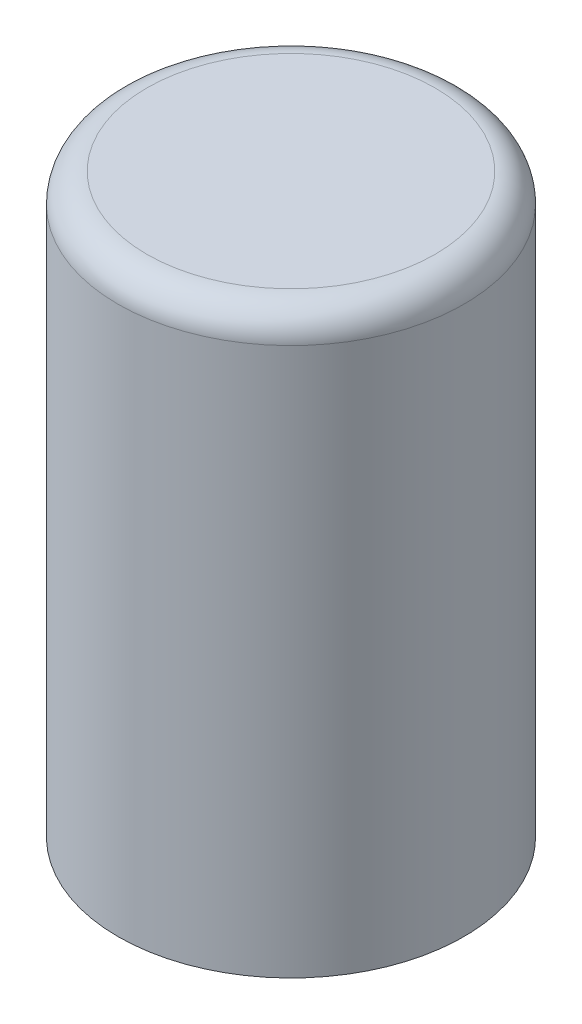
ISO-10303-21;
HEADER;
FILE_DESCRIPTION(('STEP AP214'),'2;1');
FILE_NAME('part.step','',(''),(''),'','','');
FILE_SCHEMA(('AUTOMOTIVE_DESIGN { 1 0 10303 214 1 1 1 1 }'));
ENDSEC;
DATA;
#1=APPLICATION_CONTEXT('core data for automotive mechanical design processes');
#2=APPLICATION_PROTOCOL_DEFINITION('international standard','automotive_design',2000,#1);
#3=PRODUCT_CONTEXT('',#1,'mechanical');
#4=PRODUCT('Part','Part','',(#3));
#5=PRODUCT_RELATED_PRODUCT_CATEGORY('part','',(#4));
#6=PRODUCT_DEFINITION_FORMATION('','',#4);
#7=PRODUCT_DEFINITION_CONTEXT('part definition',#1,'design');
#8=PRODUCT_DEFINITION('design','',#6,#7);
#9=PRODUCT_DEFINITION_SHAPE('','',#8);
#10=(LENGTH_UNIT() NAMED_UNIT(*) SI_UNIT(.MILLI.,.METRE.));
#11=(NAMED_UNIT(*) PLANE_ANGLE_UNIT() SI_UNIT($,.RADIAN.));
#12=(NAMED_UNIT(*) SI_UNIT($,.STERADIAN.) SOLID_ANGLE_UNIT());
#13=UNCERTAINTY_MEASURE_WITH_UNIT(LENGTH_MEASURE(1.E-05),#10,'distance_accuracy_value','');
#14=(GEOMETRIC_REPRESENTATION_CONTEXT(3) GLOBAL_UNCERTAINTY_ASSIGNED_CONTEXT((#13)) GLOBAL_UNIT_ASSIGNED_CONTEXT((#10,
#11,#12)) REPRESENTATION_CONTEXT('',''));
#15=CARTESIAN_POINT('',(0.,0.,0.));
#16=DIRECTION('',(0.,0.,1.));
#17=DIRECTION('',(1.,0.,0.));
#18=AXIS2_PLACEMENT_3D('',#15,#16,#17);
#19=CARTESIAN_POINT('',(-3.4477645620508,10.,0.60242802446991));
#20=DIRECTION('',(0.111461551224573,0.,-0.993768747042596));
#21=DIRECTION('',(-0.993768747042596,0.,-0.111461551224573));
#22=AXIS2_PLACEMENT_3D('',#19,#20,#21);
#23=PLANE('',#22);
#24=DIRECTION('',(0.,-1.,0.));
#25=VECTOR('',#24,1.);
#26=CARTESIAN_POINT('',(3.22863843537388,10.,1.35125639818153));
#27=LINE('',#26,#25);
#28=CARTESIAN_POINT('',(3.22863843537388,9.,1.35125639818153));
#29=VERTEX_POINT('',#28);
#30=CARTESIAN_POINT('',(3.22863843537388,2.,1.35125639818153));
#31=VERTEX_POINT('',#30);
#32=EDGE_CURVE('E54',#29,#31,#27,.T.);
#33=ORIENTED_EDGE('',*,*,#32,.F.);
#34=DIRECTION('',(-0.993768747042596,0.,-0.111461551224573));
#35=VECTOR('',#34,1.);
#36=CARTESIAN_POINT('',(-3.4477645620508,9.,0.60242802446991));
#37=LINE('',#36,#35);
#38=CARTESIAN_POINT('',(-3.4477645620508,9.,0.60242802446991));
#39=VERTEX_POINT('',#38);
#40=EDGE_CURVE('E131',#29,#39,#37,.T.);
#41=ORIENTED_EDGE('',*,*,#40,.T.);
#42=DIRECTION('',(0.,-1.,0.));
#43=VECTOR('',#42,1.);
#44=CARTESIAN_POINT('',(-3.4477645620508,10.,0.60242802446991));
#45=LINE('',#44,#43);
#46=CARTESIAN_POINT('',(-3.4477645620508,2.00000000000001,0.60242802446991));
#47=VERTEX_POINT('',#46);
#48=EDGE_CURVE('E261',#39,#47,#45,.T.);
#49=ORIENTED_EDGE('',*,*,#48,.T.);
#50=CARTESIAN_POINT('',(-3.44776456205079,2.00000000000001,0.602428024469908));
#51=CARTESIAN_POINT('',(-3.36066880792371,2.08410695387416,0.612196723565115));
#52=CARTESIAN_POINT('',(-3.27345134251375,2.16808684406926,0.621979073852746));
#53=CARTESIAN_POINT('',(-3.098692096425,2.33569934252852,0.641580149774943));
#54=CARTESIAN_POINT('',(-3.011150324592,2.41933196013484,0.651398874417363));
#55=CARTESIAN_POINT('',(-2.83565576794383,2.58616236668172,0.671082423103801));
#56=CARTESIAN_POINT('',(-2.74770297800271,2.66936015017177,0.680947247722748));
#57=CARTESIAN_POINT('',(-2.57124411390896,2.83516399153683,0.70073895356754));
#58=CARTESIAN_POINT('',(-2.48273802468699,2.91777003316286,0.71066583648357));
#59=CARTESIAN_POINT('',(-2.39388600688512,3.00000000000003,0.720631518905263));
#60=B_SPLINE_CURVE_WITH_KNOTS('',3,(#50,#51,#52,#53,#54,#55,#56,#57,#58,#59),.UNSPECIFIED.,.F.,
.F.,(4,2,2,2,4),(0.,0.364411839279153,0.728813810980275,1.0932203394489,1.45763683630451),.UNSPECIFIED.);
#61=CARTESIAN_POINT('',(-2.3938860068851,3.,0.720631518905266));
#62=VERTEX_POINT('',#61);
#63=EDGE_CURVE('E236',#47,#62,#60,.T.);
#64=ORIENTED_EDGE('',*,*,#63,.T.);
#65=DIRECTION('',(-0.993768747042597,0.,-0.111461551224573));
#66=VECTOR('',#65,1.);
#67=CARTESIAN_POINT('',(-3.4477645620508,3.,0.60242802446991));
#68=LINE('',#67,#66);
#69=CARTESIAN_POINT('',(2.17475988020817,3.,1.23305290374617));
#70=VERTEX_POINT('',#69);
#71=EDGE_CURVE('E262',#70,#62,#68,.T.);
#72=ORIENTED_EDGE('',*,*,#71,.F.);
#73=CARTESIAN_POINT('',(2.17475988020817,3.,1.23305290374617));
#74=CARTESIAN_POINT('',(2.26361189801006,2.91777003316285,1.24301858616787));
#75=CARTESIAN_POINT('',(2.35211798723204,2.83516399153683,1.2529454690839));
#76=CARTESIAN_POINT('',(2.52857685132579,2.66936015017177,1.27273717492869));
#77=CARTESIAN_POINT('',(2.6165296412669,2.58616236668172,1.28260199954764));
#78=CARTESIAN_POINT('',(2.79202419791508,2.41933196013483,1.30228554823407));
#79=CARTESIAN_POINT('',(2.87956596974808,2.33569934252851,1.31210427287649));
#80=CARTESIAN_POINT('',(3.05432521583683,2.16808684406924,1.33170534879869));
#81=CARTESIAN_POINT('',(3.1415426812468,2.08410695387415,1.34148769908632));
#82=CARTESIAN_POINT('',(3.22863843537388,2.,1.35125639818153));
#83=B_SPLINE_CURVE_WITH_KNOTS('',3,(#73,#74,#75,#76,#77,#78,#79,#80,#81,#82),.UNSPECIFIED.,.F.,
.F.,(4,2,2,2,4),(0.,0.364416496855611,0.728823025324241,1.09322499702537,1.45763683630453),.UNSPECIFIED.);
#84=EDGE_CURVE('E199',#70,#31,#83,.T.);
#85=ORIENTED_EDGE('',*,*,#84,.T.);
#86=EDGE_LOOP('',(#33,#41,#49,#64,#72,#85));
#87=FACE_BOUND('',#86,.T.);
#88=ADVANCED_FACE('F39',(#87),#23,.F.);
#89=CARTESIAN_POINT('',(-3.22863843537388,10.,-1.35125639818152));
#90=DIRECTION('',(-0.111461551224573,0.,0.993768747042596));
#91=DIRECTION('',(0.993768747042596,0.,0.111461551224573));
#92=AXIS2_PLACEMENT_3D('',#89,#90,#91);
#93=PLANE('',#92);
#94=DIRECTION('',(0.,-1.,0.));
#95=VECTOR('',#94,1.);
#96=CARTESIAN_POINT('',(-3.22863843537388,10.,-1.35125639818152));
#97=LINE('',#96,#95);
#98=CARTESIAN_POINT('',(-3.22863843537388,9.,-1.35125639818152));
#99=VERTEX_POINT('',#98);
#100=CARTESIAN_POINT('',(-3.22863843537388,2.00000000000001,-1.35125639818152));
#101=VERTEX_POINT('',#100);
#102=EDGE_CURVE('E271',#99,#101,#97,.T.);
#103=ORIENTED_EDGE('',*,*,#102,.F.);
#104=DIRECTION('',(0.993768747042596,0.,0.111461551224573));
#105=VECTOR('',#104,1.);
#106=CARTESIAN_POINT('',(-3.22863843537388,9.,-1.35125639818152));
#107=LINE('',#106,#105);
#108=CARTESIAN_POINT('',(3.44776456205079,9.,-0.602428024469899));
#109=VERTEX_POINT('',#108);
#110=EDGE_CURVE('E138',#99,#109,#107,.T.);
#111=ORIENTED_EDGE('',*,*,#110,.T.);
#112=DIRECTION('',(0.,-1.,0.));
#113=VECTOR('',#112,1.);
#114=CARTESIAN_POINT('',(3.44776456205079,10.,-0.602428024469899));
#115=LINE('',#114,#113);
#116=CARTESIAN_POINT('',(3.44776456205079,2.,-0.602428024469899));
#117=VERTEX_POINT('',#116);
#118=EDGE_CURVE('E62',#109,#117,#115,.T.);
#119=ORIENTED_EDGE('',*,*,#118,.T.);
#120=CARTESIAN_POINT('',(3.44776456205079,2.,-0.602428024469899));
#121=CARTESIAN_POINT('',(3.36066880792371,2.08410695387414,-0.612196723565104));
#122=CARTESIAN_POINT('',(3.27345134251375,2.16808684406924,-0.621979073852734));
#123=CARTESIAN_POINT('',(3.09869209642499,2.33569934252851,-0.641580149774932));
#124=CARTESIAN_POINT('',(3.011150324592,2.41933196013483,-0.651398874417352));
#125=CARTESIAN_POINT('',(2.83565576794382,2.58616236668172,-0.671082423103791));
#126=CARTESIAN_POINT('',(2.7477029780027,2.66936015017177,-0.680947247722738));
#127=CARTESIAN_POINT('',(2.57124411390896,2.83516399153683,-0.70073895356753));
#128=CARTESIAN_POINT('',(2.48273802468698,2.91777003316286,-0.71066583648356));
#129=CARTESIAN_POINT('',(2.39388600688511,3.00000000000003,-0.720631518905252));
#130=B_SPLINE_CURVE_WITH_KNOTS('',3,(#120,#121,#122,#123,#124,#125,#126,#127,#128,#129),
.UNSPECIFIED.,.F.,.F.,(4,2,2,2,4),(0.,0.364411839279158,0.728813810980285,1.09322033944892,
1.45763683630453),.UNSPECIFIED.);
#131=CARTESIAN_POINT('',(2.39388600688509,3.,-0.720631518905255));
#132=VERTEX_POINT('',#131);
#133=EDGE_CURVE('E206',#117,#132,#130,.T.);
#134=ORIENTED_EDGE('',*,*,#133,.T.);
#135=DIRECTION('',(0.993768747042597,0.,0.111461551224573));
#136=VECTOR('',#135,1.);
#137=CARTESIAN_POINT('',(-3.22863843537388,3.,-1.35125639818152));
#138=LINE('',#137,#136);
#139=CARTESIAN_POINT('',(-2.17475988020819,3.,-1.23305290374616));
#140=VERTEX_POINT('',#139);
#141=EDGE_CURVE('E267',#140,#132,#138,.T.);
#142=ORIENTED_EDGE('',*,*,#141,.F.);
#143=CARTESIAN_POINT('',(-2.17475988020819,3.,-1.23305290374616));
#144=CARTESIAN_POINT('',(-2.26361189801007,2.91777003316285,-1.24301858616786));
#145=CARTESIAN_POINT('',(-2.35211798723205,2.83516399153683,-1.25294546908389));
#146=CARTESIAN_POINT('',(-2.5285768513258,2.66936015017177,-1.27273717492868));
#147=CARTESIAN_POINT('',(-2.61652964126692,2.58616236668172,-1.28260199954763));
#148=CARTESIAN_POINT('',(-2.79202419791509,2.41933196013484,-1.30228554823406));
#149=CARTESIAN_POINT('',(-2.87956596974809,2.33569934252852,-1.31210427287648));
#150=CARTESIAN_POINT('',(-3.05432521583684,2.16808684406926,-1.33170534879868));
#151=CARTESIAN_POINT('',(-3.1415426812468,2.08410695387416,-1.34148769908631));
#152=CARTESIAN_POINT('',(-3.22863843537389,2.00000000000002,-1.35125639818152));
#153=B_SPLINE_CURVE_WITH_KNOTS('',3,(#143,#144,#145,#146,#147,#148,#149,#150,#151,#152),
.UNSPECIFIED.,.F.,.F.,(4,2,2,2,4),(0.,0.364416496855605,0.72882302532423,1.09322499702535,
1.45763683630451),.UNSPECIFIED.);
#154=EDGE_CURVE('E230',#140,#101,#153,.T.);
#155=ORIENTED_EDGE('',*,*,#154,.T.);
#156=EDGE_LOOP('',(#103,#111,#119,#134,#142,#155));
#157=FACE_BOUND('',#156,.T.);
#158=ADVANCED_FACE('F252',(#157),#93,.F.);
#159=CARTESIAN_POINT('',(0.,20.,0.));
#160=DIRECTION('',(0.,-1.,0.));
#161=DIRECTION('',(0.,0.,-1.));
#162=AXIS2_PLACEMENT_3D('',#159,#160,#161);
#163=CYLINDRICAL_SURFACE('',#162,6.);
#164=CARTESIAN_POINT('',(0.,19.,0.));
#165=DIRECTION('',(0.,1.,0.));
#166=DIRECTION('',(0.,0.,1.));
#167=AXIS2_PLACEMENT_3D('',#164,#165,#166);
#168=CIRCLE('',#167,6.);
#169=CARTESIAN_POINT('',(0.,19.,6.));
#170=VERTEX_POINT('',#169);
#171=EDGE_CURVE('E11',#170,#170,#168,.F.);
#172=ORIENTED_EDGE('',*,*,#171,.T.);
#173=EDGE_LOOP('',(#172));
#174=FACE_BOUND('',#173,.T.);
#175=CARTESIAN_POINT('',(0.,0.,0.));
#176=DIRECTION('',(0.,1.,0.));
#177=DIRECTION('',(0.,0.,1.));
#178=AXIS2_PLACEMENT_3D('',#175,#176,#177);
#179=CIRCLE('',#178,6.);
#180=CARTESIAN_POINT('',(0.,0.,6.));
#181=VERTEX_POINT('',#180);
#182=EDGE_CURVE('E122',#181,#181,#179,.T.);
#183=ORIENTED_EDGE('',*,*,#182,.T.);
#184=EDGE_LOOP('',(#183));
#185=FACE_BOUND('',#184,.T.);
#186=ADVANCED_FACE('F257',(#174,#185),#163,.T.);
#187=CARTESIAN_POINT('',(0.,20.,0.));
#188=DIRECTION('',(0.,1.,0.));
#189=DIRECTION('',(0.,0.,1.));
#190=AXIS2_PLACEMENT_3D('',#187,#188,#189);
#191=PLANE('',#190);
#192=CARTESIAN_POINT('',(0.,20.,0.));
#193=DIRECTION('',(0.,1.,0.));
#194=DIRECTION('',(0.,0.,1.));
#195=AXIS2_PLACEMENT_3D('',#192,#193,#194);
#196=CIRCLE('',#195,5.);
#197=CARTESIAN_POINT('',(0.,20.,5.));
#198=VERTEX_POINT('',#197);
#199=EDGE_CURVE('E47',#198,#198,#196,.T.);
#200=ORIENTED_EDGE('',*,*,#199,.T.);
#201=EDGE_LOOP('',(#200));
#202=FACE_BOUND('',#201,.T.);
#203=ADVANCED_FACE('F244',(#202),#191,.T.);
#204=CARTESIAN_POINT('',(0.,0.,0.));
#205=DIRECTION('',(0.,1.,0.));
#206=DIRECTION('',(0.,0.,1.));
#207=AXIS2_PLACEMENT_3D('',#204,#205,#206);
#208=PLANE('',#207);
#209=CARTESIAN_POINT('',(0.,0.,0.));
#210=DIRECTION('',(0.,-1.,0.));
#211=DIRECTION('',(0.,0.,-1.));
#212=AXIS2_PLACEMENT_3D('',#209,#210,#211);
#213=CIRCLE('',#212,3.5);
#214=CARTESIAN_POINT('',(0.,0.,-3.5));
#215=VERTEX_POINT('',#214);
#216=EDGE_CURVE('E264',#215,#215,#213,.T.);
#217=ORIENTED_EDGE('',*,*,#216,.F.);
#218=EDGE_LOOP('',(#217));
#219=FACE_BOUND('',#218,.T.);
#220=ORIENTED_EDGE('',*,*,#182,.F.);
#221=EDGE_LOOP('',(#220));
#222=FACE_BOUND('',#221,.T.);
#223=ADVANCED_FACE('F311',(#219,#222),#208,.F.);
#224=CARTESIAN_POINT('',(0.,10.,0.));
#225=DIRECTION('',(0.,-1.,0.));
#226=DIRECTION('',(0.,0.,-1.));
#227=AXIS2_PLACEMENT_3D('',#224,#225,#226);
#228=PLANE('',#227);
#229=DIRECTION('',(0.993768747042596,0.,0.111461551224573));
#230=VECTOR('',#229,1.);
#231=CARTESIAN_POINT('',(-0.221024614563029,10.,1.97061095836831));
#232=LINE('',#231,#230);
#233=CARTESIAN_POINT('',(-1.73398345967418,10.,1.80091681139812));
#234=VERTEX_POINT('',#233);
#235=CARTESIAN_POINT('',(1.29193423054812,10.,2.1403051053385));
#236=VERTEX_POINT('',#235);
#237=EDGE_CURVE('E119',#234,#236,#232,.T.);
#238=ORIENTED_EDGE('',*,*,#237,.T.);
#239=CARTESIAN_POINT('',(0.,10.,0.));
#240=DIRECTION('',(0.,-1.,0.));
#241=DIRECTION('',(0.,0.,-1.));
#242=AXIS2_PLACEMENT_3D('',#239,#240,#241);
#243=CIRCLE('',#242,2.5);
#244=EDGE_CURVE('E111',#236,#234,#243,.T.);
#245=ORIENTED_EDGE('',*,*,#244,.T.);
#246=EDGE_LOOP('',(#238,#245));
#247=FACE_BOUND('',#246,.T.);
#248=ADVANCED_FACE('F124',(#247),#228,.T.);
#249=CARTESIAN_POINT('',(0.,10.,0.));
#250=DIRECTION('',(0.,-1.,0.));
#251=DIRECTION('',(0.,0.,-1.));
#252=AXIS2_PLACEMENT_3D('',#249,#250,#251);
#253=CYLINDRICAL_SURFACE('',#252,3.5);
#254=ORIENTED_EDGE('',*,*,#216,.T.);
#255=EDGE_LOOP('',(#254));
#256=FACE_BOUND('',#255,.T.);
#257=ORIENTED_EDGE('',*,*,#32,.T.);
#258=CARTESIAN_POINT('',(0.,2.,0.));
#259=DIRECTION('',(0.,-1.,0.));
#260=DIRECTION('',(0.,0.,-1.));
#261=AXIS2_PLACEMENT_3D('',#258,#259,#260);
#262=CIRCLE('',#261,3.5);
#263=EDGE_CURVE('E197',#31,#117,#262,.F.);
#264=ORIENTED_EDGE('',*,*,#263,.T.);
#265=ORIENTED_EDGE('',*,*,#118,.F.);
#266=CARTESIAN_POINT('',(0.,9.,0.));
#267=DIRECTION('',(0.,-1.,0.));
#268=DIRECTION('',(0.,0.,-1.));
#269=AXIS2_PLACEMENT_3D('',#266,#267,#268);
#270=CIRCLE('',#269,3.5);
#271=EDGE_CURVE('E125',#109,#99,#270,.F.);
#272=ORIENTED_EDGE('',*,*,#271,.T.);
#273=ORIENTED_EDGE('',*,*,#102,.T.);
#274=CARTESIAN_POINT('',(0.,2.00000000000001,0.));
#275=DIRECTION('',(0.,-1.,0.));
#276=DIRECTION('',(0.,0.,-1.));
#277=AXIS2_PLACEMENT_3D('',#274,#275,#276);
#278=CIRCLE('',#277,3.5);
#279=EDGE_CURVE('E194',#101,#47,#278,.F.);
#280=ORIENTED_EDGE('',*,*,#279,.T.);
#281=ORIENTED_EDGE('',*,*,#48,.F.);
#282=CARTESIAN_POINT('',(0.,9.,0.));
#283=DIRECTION('',(0.,-1.,0.));
#284=DIRECTION('',(0.,0.,-1.));
#285=AXIS2_PLACEMENT_3D('',#282,#283,#284);
#286=CIRCLE('',#285,3.5);
#287=EDGE_CURVE('E112',#39,#29,#286,.F.);
#288=ORIENTED_EDGE('',*,*,#287,.T.);
#289=EDGE_LOOP('',(#257,#264,#265,#272,#273,#280,#281,#288));
#290=FACE_BOUND('',#289,.T.);
#291=ADVANCED_FACE('F284',(#256,#290),#253,.F.);
#292=CARTESIAN_POINT('',(0.,10.,0.));
#293=DIRECTION('',(0.,-1.,0.));
#294=DIRECTION('',(0.,0.,-1.));
#295=AXIS2_PLACEMENT_3D('',#292,#293,#294);
#296=PLANE('',#295);
#297=CARTESIAN_POINT('',(0.,10.,0.));
#298=DIRECTION('',(0.,-1.,0.));
#299=DIRECTION('',(0.,0.,-1.));
#300=AXIS2_PLACEMENT_3D('',#297,#298,#299);
#301=CIRCLE('',#300,2.5);
#302=CARTESIAN_POINT('',(-1.29193423054813,10.,-2.14030510533849));
#303=VERTEX_POINT('',#302);
#304=CARTESIAN_POINT('',(1.73398345967418,10.,-1.80091681139812));
#305=VERTEX_POINT('',#304);
#306=EDGE_CURVE('E133',#303,#305,#301,.T.);
#307=ORIENTED_EDGE('',*,*,#306,.T.);
#308=DIRECTION('',(-0.993768747042596,0.,-0.111461551224573));
#309=VECTOR('',#308,1.);
#310=CARTESIAN_POINT('',(0.221024614563028,10.,-1.9706109583683));
#311=LINE('',#310,#309);
#312=EDGE_CURVE('E135',#305,#303,#311,.T.);
#313=ORIENTED_EDGE('',*,*,#312,.T.);
#314=EDGE_LOOP('',(#307,#313));
#315=FACE_BOUND('',#314,.T.);
#316=ADVANCED_FACE('F297',(#315),#296,.T.);
#317=CARTESIAN_POINT('',(0.,3.,0.));
#318=DIRECTION('',(0.,-1.,0.));
#319=DIRECTION('',(0.,0.,-1.));
#320=AXIS2_PLACEMENT_3D('',#317,#318,#319);
#321=PLANE('',#320);
#322=ORIENTED_EDGE('',*,*,#141,.T.);
#323=CARTESIAN_POINT('',(0.,3.,0.));
#324=DIRECTION('',(0.,-1.,0.));
#325=DIRECTION('',(0.,0.,-1.));
#326=AXIS2_PLACEMENT_3D('',#323,#324,#325);
#327=CIRCLE('',#326,2.49999999999999);
#328=EDGE_CURVE('E191',#132,#70,#327,.T.);
#329=ORIENTED_EDGE('',*,*,#328,.T.);
#330=ORIENTED_EDGE('',*,*,#71,.T.);
#331=CARTESIAN_POINT('',(0.,3.,0.));
#332=DIRECTION('',(0.,-1.,0.));
#333=DIRECTION('',(0.,0.,-1.));
#334=AXIS2_PLACEMENT_3D('',#331,#332,#333);
#335=CIRCLE('',#334,2.5);
#336=EDGE_CURVE('E139',#62,#140,#335,.T.);
#337=ORIENTED_EDGE('',*,*,#336,.T.);
#338=EDGE_LOOP('',(#322,#329,#330,#337));
#339=FACE_BOUND('',#338,.T.);
#340=ADVANCED_FACE('F161',(#339),#321,.T.);
#341=CARTESIAN_POINT('',(-0.221024614563029,10.,1.97061095836831));
#342=DIRECTION('',(0.078815218712467,0.707106781186547,-0.702700619965079));
#343=DIRECTION('',(0.993768747042596,0.,0.111461551224573));
#344=AXIS2_PLACEMENT_3D('',#341,#342,#343);
#345=PLANE('',#344);
#346=CARTESIAN_POINT('',(-1.73398345967418,10.,1.80091681139812));
#347=CARTESIAN_POINT('',(-1.86969234754285,9.95174980951567,1.73714290642301));
#348=CARTESIAN_POINT('',(-2.00091789029849,9.89815517011283,1.66849389510957));
#349=CARTESIAN_POINT('',(-2.25457558935869,9.7822853650366,1.5234471866852));
#350=CARTESIAN_POINT('',(-2.37702704649109,9.72003019777943,1.4470674485975));
#351=CARTESIAN_POINT('',(-2.61264646185154,9.58931916746213,1.28910963766901));
#352=CARTESIAN_POINT('',(-2.72590020834546,9.52093731667911,1.20759641913573));
#353=CARTESIAN_POINT('',(-2.9453392221587,9.37872577109638,1.03988078211499));
#354=CARTESIAN_POINT('',(-3.05152211458289,9.30489426329489,0.953676805626963));
#355=CARTESIAN_POINT('',(-3.20478252178574,9.19176885510784,0.822652307922962));
#356=CARTESIAN_POINT('',(-3.25430518721104,9.15413095391188,0.779223920349421));
#357=CARTESIAN_POINT('',(-3.35203717314345,9.07780664185072,0.69145936639559));
#358=CARTESIAN_POINT('',(-3.40024256829652,9.03911766461159,0.647121057818859));
#359=CARTESIAN_POINT('',(-3.44776456205081,9.00000000000001,0.602428024469914));
#360=B_SPLINE_CURVE_WITH_KNOTS('',3,(#346,#347,#348,#349,#350,#351,#352,#353,#354,#355,#356,
#357,#358,#359),.UNSPECIFIED.,.F.,.F.,(4,2,2,2,2,2,4),(0.,0.471964557529695,0.942856832428813,
1.40867699650354,1.87465283507708,2.10222200455394,2.33040824469075),.UNSPECIFIED.);
#361=EDGE_CURVE('E107',#39,#234,#360,.F.);
#362=ORIENTED_EDGE('',*,*,#361,.F.);
#363=ORIENTED_EDGE('',*,*,#40,.F.);
#364=CARTESIAN_POINT('',(3.22863843537388,9.,1.35125639818153));
#365=CARTESIAN_POINT('',(3.16422154382266,9.04480204144352,1.38911433535063));
#366=CARTESIAN_POINT('',(3.09903493180141,9.08904269482962,1.42632103218143));
#367=CARTESIAN_POINT('',(2.96700283552292,9.17627100569659,1.49928751338757));
#368=CARTESIAN_POINT('',(2.90015688212614,9.21925830117507,1.53504688087176));
#369=CARTESIAN_POINT('',(2.69643840970312,9.34646150009441,1.64019852936236));
#370=CARTESIAN_POINT('',(2.55692424558893,9.42854019440536,1.70714391213774));
#371=CARTESIAN_POINT('',(2.27293196027332,9.58392518615299,1.83165051536787));
#372=CARTESIAN_POINT('',(2.12859496163115,9.65736655041782,1.88936347793362));
#373=CARTESIAN_POINT('',(1.83232594334834,9.79510233027081,1.9947332390647));
#374=CARTESIAN_POINT('',(1.68041040679456,9.85941551955317,2.04241077779185));
#375=CARTESIAN_POINT('',(1.48641886362909,9.93232072663588,2.09401494516947));
#376=CARTESIAN_POINT('',(1.44789245208527,9.9463626736951,2.10382380009114));
#377=CARTESIAN_POINT('',(1.37029860412379,9.97373505077917,2.12266484986305));
#378=CARTESIAN_POINT('',(1.3312301573967,9.98706383389757,2.13169527416345));
#379=CARTESIAN_POINT('',(1.29193423054812,10.,2.1403051053385));
#380=B_SPLINE_CURVE_WITH_KNOTS('',3,(#364,#365,#366,#367,#368,#369,#370,#371,#372,#373,#374,
#375,#376,#377,#378,#379),.UNSPECIFIED.,.F.,.F.,(4,2,2,2,2,2,2,4),(0.,0.261345108676299,
0.522764967545388,1.04779843976003,1.56303907759655,2.07720418142978,2.2036793655239,
2.33043501959396),.UNSPECIFIED.);
#381=EDGE_CURVE('E115',#236,#29,#380,.F.);
#382=ORIENTED_EDGE('',*,*,#381,.F.);
#383=ORIENTED_EDGE('',*,*,#237,.F.);
#384=EDGE_LOOP('',(#362,#363,#382,#383));
#385=FACE_BOUND('',#384,.T.);
#386=ADVANCED_FACE('F120',(#385),#345,.F.);
#387=CARTESIAN_POINT('',(0.,10.,0.));
#388=DIRECTION('',(0.,-1.,0.));
#389=DIRECTION('',(0.,0.,-1.));
#390=AXIS2_PLACEMENT_3D('',#387,#388,#389);
#391=CONICAL_SURFACE('',#390,2.5,0.785398163397448);
#392=ORIENTED_EDGE('',*,*,#381,.T.);
#393=ORIENTED_EDGE('',*,*,#287,.F.);
#394=ORIENTED_EDGE('',*,*,#361,.T.);
#395=ORIENTED_EDGE('',*,*,#244,.F.);
#396=EDGE_LOOP('',(#392,#393,#394,#395));
#397=FACE_BOUND('',#396,.T.);
#398=ADVANCED_FACE('F109',(#397),#391,.F.);
#399=CARTESIAN_POINT('',(0.,10.,0.));
#400=DIRECTION('',(0.,-1.,0.));
#401=DIRECTION('',(0.,0.,-1.));
#402=AXIS2_PLACEMENT_3D('',#399,#400,#401);
#403=CONICAL_SURFACE('',#402,2.5,0.78539816339745);
#404=CARTESIAN_POINT('',(-1.29193423054813,10.,-2.14030510533849));
#405=CARTESIAN_POINT('',(-1.43839920057333,9.95174980951567,-2.10817994762925));
#406=CARTESIAN_POINT('',(-1.5815722266193,9.89815517011283,-2.07030760364757));
#407=CARTESIAN_POINT('',(-1.86105998210727,9.78228536503659,-1.98505873005058));
#408=CARTESIAN_POINT('',(-1.99738955426813,9.72003019777943,-1.93770398901412));
#409=CARTESIAN_POINT('',(-2.26214747803123,9.58931916746213,-1.83586872629647));
#410=CARTESIAN_POINT('',(-2.39064511885291,9.52093731667911,-1.78147045248356));
#411=CARTESIAN_POINT('',(-2.64178637161155,9.37872577109637,-1.66653531056681));
#412=CARTESIAN_POINT('',(-2.76442801281334,9.30489426329489,-1.60599639705454));
#413=CARTESIAN_POINT('',(-2.94290668697508,9.19176885510784,-1.51217990445309));
#414=CARTESIAN_POINT('',(-3.00081971010465,9.15413095391188,-1.48080155220098));
#415=CARTESIAN_POINT('',(-3.11556614847403,9.07780664185072,-1.41686867422299));
#416=CARTESIAN_POINT('',(-3.17239621046383,9.03911766461159,-1.38431118992914));
#417=CARTESIAN_POINT('',(-3.22863843537389,9.00000000000001,-1.35125639818153));
#418=B_SPLINE_CURVE_WITH_KNOTS('',3,(#404,#405,#406,#407,#408,#409,#410,#411,#412,#413,#414,
#415,#416,#417),.UNSPECIFIED.,.F.,.F.,(4,2,2,2,2,2,4),(0.,0.471964557529696,0.942856832428815,
1.40867699650354,1.87465283507709,2.10222200455394,2.33040824469074),.UNSPECIFIED.);
#419=EDGE_CURVE('E178',#99,#303,#418,.F.);
#420=ORIENTED_EDGE('',*,*,#419,.F.);
#421=ORIENTED_EDGE('',*,*,#271,.F.);
#422=CARTESIAN_POINT('',(3.44776456205079,9.,-0.602428024469899));
#423=CARTESIAN_POINT('',(3.39333508057422,9.04480204144352,-0.653615824481353));
#424=CARTESIAN_POINT('',(3.33801073226018,9.08904269482962,-0.704339085018249));
#425=CARTESIAN_POINT('',(3.22542384166154,9.17627100569659,-0.804742142205931));
#426=CARTESIAN_POINT('',(3.16816074953873,9.21925830117507,-0.85442163625455));
#427=CARTESIAN_POINT('',(2.99279880886026,9.34646150009441,-1.00209111498371));
#428=CARTESIAN_POINT('',(2.87158188192685,9.42854019440536,-1.09828021461689));
#429=CARTESIAN_POINT('',(2.62222850104565,9.58392518615299,-1.28260710850329));
#430=CARTESIAN_POINT('',(2.4942632791735,9.65736655041782,-1.37086161103067));
#431=CARTESIAN_POINT('',(2.22869874825377,9.79510233027081,-1.53924687663447));
#432=CARTESIAN_POINT('',(2.09112010738321,9.85941551955317,-1.6193942129702));
#433=CARTESIAN_POINT('',(1.91338081916532,9.93232072663588,-1.71269187818351));
#434=CARTESIAN_POINT('',(1.87798468202437,9.9463626736951,-1.730791919532));
#435=CARTESIAN_POINT('',(1.80649276928387,9.97373505077917,-1.76635449551691));
#436=CARTESIAN_POINT('',(1.77039561624141,9.98706383389757,-1.78381552741488));
#437=CARTESIAN_POINT('',(1.73398345967418,10.,-1.80091681139812));
#438=B_SPLINE_CURVE_WITH_KNOTS('',3,(#422,#423,#424,#425,#426,#427,#428,#429,#430,#431,#432,
#433,#434,#435,#436,#437),.UNSPECIFIED.,.F.,.F.,(4,2,2,2,2,2,2,4),(0.,0.261345108676299,
0.522764967545388,1.04779843976003,1.56303907759655,2.07720418142978,2.2036793655239,
2.33043501959396),.UNSPECIFIED.);
#439=EDGE_CURVE('E116',#305,#109,#438,.F.);
#440=ORIENTED_EDGE('',*,*,#439,.F.);
#441=ORIENTED_EDGE('',*,*,#306,.F.);
#442=EDGE_LOOP('',(#420,#421,#440,#441));
#443=FACE_BOUND('',#442,.T.);
#444=ADVANCED_FACE('F173',(#443),#403,.F.);
#445=CARTESIAN_POINT('',(0.221024614563028,10.,-1.9706109583683));
#446=DIRECTION('',(-0.0788152187124669,0.707106781186548,0.702700619965078));
#447=DIRECTION('',(-0.993768747042596,0.,-0.111461551224573));
#448=AXIS2_PLACEMENT_3D('',#445,#446,#447);
#449=PLANE('',#448);
#450=ORIENTED_EDGE('',*,*,#439,.T.);
#451=ORIENTED_EDGE('',*,*,#110,.F.);
#452=ORIENTED_EDGE('',*,*,#419,.T.);
#453=ORIENTED_EDGE('',*,*,#312,.F.);
#454=EDGE_LOOP('',(#450,#451,#452,#453));
#455=FACE_BOUND('',#454,.T.);
#456=ADVANCED_FACE('F163',(#455),#449,.F.);
#457=CARTESIAN_POINT('',(0.,3.,0.));
#458=DIRECTION('',(0.,-1.,0.));
#459=DIRECTION('',(0.,0.,-1.));
#460=AXIS2_PLACEMENT_3D('',#457,#458,#459);
#461=CONICAL_SURFACE('',#460,2.49999999999999,0.785398163397454);
#462=ORIENTED_EDGE('',*,*,#133,.F.);
#463=ORIENTED_EDGE('',*,*,#263,.F.);
#464=ORIENTED_EDGE('',*,*,#84,.F.);
#465=ORIENTED_EDGE('',*,*,#328,.F.);
#466=EDGE_LOOP('',(#462,#463,#464,#465));
#467=FACE_BOUND('',#466,.T.);
#468=ADVANCED_FACE('F172',(#467),#461,.F.);
#469=CARTESIAN_POINT('',(0.,3.,0.));
#470=DIRECTION('',(0.,-1.,0.));
#471=DIRECTION('',(0.,0.,-1.));
#472=AXIS2_PLACEMENT_3D('',#469,#470,#471);
#473=CONICAL_SURFACE('',#472,2.5,0.785398163397455);
#474=ORIENTED_EDGE('',*,*,#63,.F.);
#475=ORIENTED_EDGE('',*,*,#279,.F.);
#476=ORIENTED_EDGE('',*,*,#154,.F.);
#477=ORIENTED_EDGE('',*,*,#336,.F.);
#478=EDGE_LOOP('',(#474,#475,#476,#477));
#479=FACE_BOUND('',#478,.T.);
#480=ADVANCED_FACE('F221',(#479),#473,.F.);
#481=CARTESIAN_POINT('',(0.,19.,0.));
#482=DIRECTION('',(0.,1.,0.));
#483=DIRECTION('',(0.,0.,1.));
#484=AXIS2_PLACEMENT_3D('',#481,#482,#483);
#485=TOROIDAL_SURFACE('',#484,5.,1.);
#486=ORIENTED_EDGE('',*,*,#171,.F.);
#487=EDGE_LOOP('',(#486));
#488=FACE_BOUND('',#487,.T.);
#489=ORIENTED_EDGE('',*,*,#199,.F.);
#490=EDGE_LOOP('',(#489));
#491=FACE_BOUND('',#490,.T.);
#492=ADVANCED_FACE('F41',(#488,#491),#485,.T.);
#493=CLOSED_SHELL('',(#88,#158,#186,#203,#223,#248,#291,#316,#340,#386,#398,#444,#456,#468,#480,#492));
#494=MANIFOLD_SOLID_BREP('B2',#493);
#495=ADVANCED_BREP_SHAPE_REPRESENTATION('',(#18,#494),#14);
#496=SHAPE_DEFINITION_REPRESENTATION(#9,#495);
ENDSEC;
END-ISO-10303-21;
